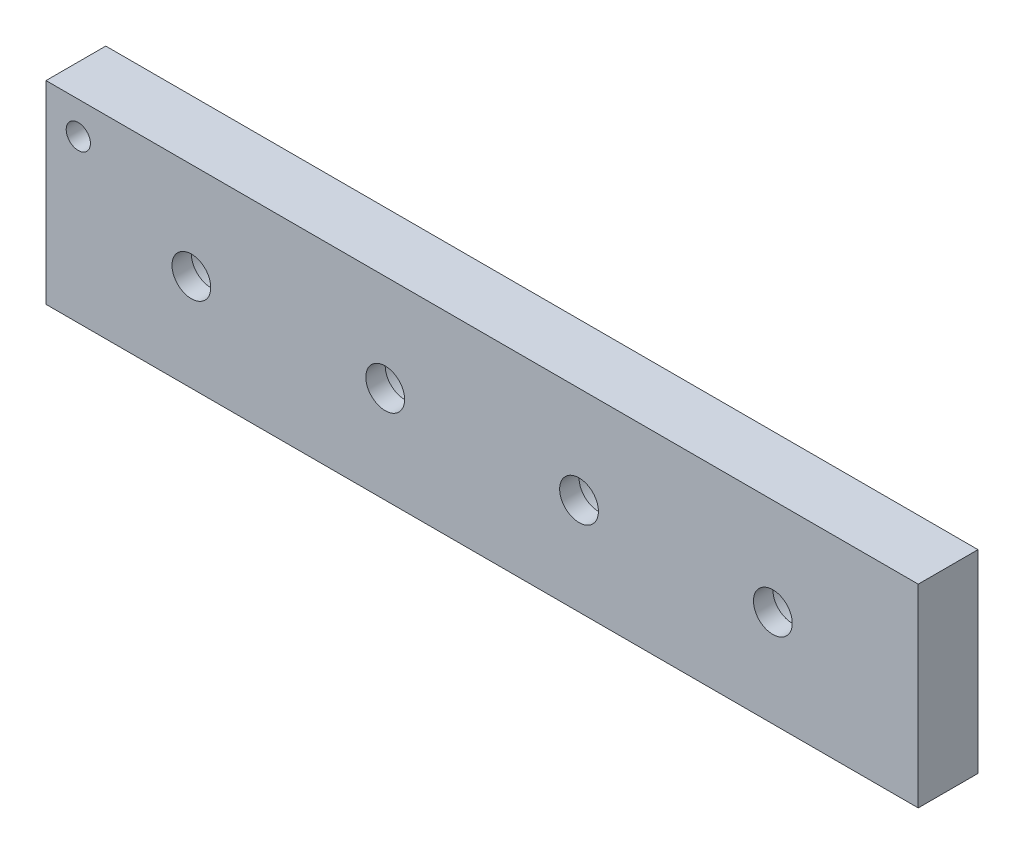
ISO-10303-21;
HEADER;
FILE_DESCRIPTION(('STEP AP214'),'2;1');
FILE_NAME('part.step','',(''),(''),'','','');
FILE_SCHEMA(('AUTOMOTIVE_DESIGN { 1 0 10303 214 1 1 1 1 }'));
ENDSEC;
DATA;
#1=APPLICATION_CONTEXT('core data for automotive mechanical design processes');
#2=APPLICATION_PROTOCOL_DEFINITION('international standard','automotive_design',2000,#1);
#3=PRODUCT_CONTEXT('',#1,'mechanical');
#4=PRODUCT('Part','Part','',(#3));
#5=PRODUCT_RELATED_PRODUCT_CATEGORY('part','',(#4));
#6=PRODUCT_DEFINITION_FORMATION('','',#4);
#7=PRODUCT_DEFINITION_CONTEXT('part definition',#1,'design');
#8=PRODUCT_DEFINITION('design','',#6,#7);
#9=PRODUCT_DEFINITION_SHAPE('','',#8);
#10=(LENGTH_UNIT() NAMED_UNIT(*) SI_UNIT(.MILLI.,.METRE.));
#11=(NAMED_UNIT(*) PLANE_ANGLE_UNIT() SI_UNIT($,.RADIAN.));
#12=(NAMED_UNIT(*) SI_UNIT($,.STERADIAN.) SOLID_ANGLE_UNIT());
#13=UNCERTAINTY_MEASURE_WITH_UNIT(LENGTH_MEASURE(1.E-05),#10,'distance_accuracy_value','');
#14=(GEOMETRIC_REPRESENTATION_CONTEXT(3) GLOBAL_UNCERTAINTY_ASSIGNED_CONTEXT((#13)) GLOBAL_UNIT_ASSIGNED_CONTEXT((#10,
#11,#12)) REPRESENTATION_CONTEXT('',''));
#15=CARTESIAN_POINT('',(0.,0.,0.));
#16=DIRECTION('',(0.,0.,1.));
#17=DIRECTION('',(1.,0.,0.));
#18=AXIS2_PLACEMENT_3D('',#15,#16,#17);
#19=CARTESIAN_POINT('',(-27.,-6.,3.7));
#20=DIRECTION('',(1.,0.,0.));
#21=DIRECTION('',(0.,0.,-1.));
#22=AXIS2_PLACEMENT_3D('',#19,#20,#21);
#23=PLANE('',#22);
#24=DIRECTION('',(0.,-1.,0.));
#25=VECTOR('',#24,1.);
#26=CARTESIAN_POINT('',(-27.,-6.,0.));
#27=LINE('',#26,#25);
#28=CARTESIAN_POINT('',(-27.,6.,0.));
#29=VERTEX_POINT('',#28);
#30=CARTESIAN_POINT('',(-27.,-6.,0.));
#31=VERTEX_POINT('',#30);
#32=EDGE_CURVE('E116',#29,#31,#27,.T.);
#33=ORIENTED_EDGE('',*,*,#32,.T.);
#34=DIRECTION('',(0.,0.,-1.));
#35=VECTOR('',#34,1.);
#36=CARTESIAN_POINT('',(-27.,-6.,3.7));
#37=LINE('',#36,#35);
#38=CARTESIAN_POINT('',(-27.,-6.,3.7));
#39=VERTEX_POINT('',#38);
#40=EDGE_CURVE('E11',#39,#31,#37,.T.);
#41=ORIENTED_EDGE('',*,*,#40,.F.);
#42=DIRECTION('',(0.,-1.,0.));
#43=VECTOR('',#42,1.);
#44=CARTESIAN_POINT('',(-27.,-6.,3.7));
#45=LINE('',#44,#43);
#46=CARTESIAN_POINT('',(-27.,6.,3.7));
#47=VERTEX_POINT('',#46);
#48=EDGE_CURVE('E97',#47,#39,#45,.T.);
#49=ORIENTED_EDGE('',*,*,#48,.F.);
#50=DIRECTION('',(0.,0.,-1.));
#51=VECTOR('',#50,1.);
#52=CARTESIAN_POINT('',(-27.,6.,3.7));
#53=LINE('',#52,#51);
#54=EDGE_CURVE('E115',#47,#29,#53,.T.);
#55=ORIENTED_EDGE('',*,*,#54,.T.);
#56=EDGE_LOOP('',(#33,#41,#49,#55));
#57=FACE_BOUND('',#56,.T.);
#58=ADVANCED_FACE('F44',(#57),#23,.F.);
#59=CARTESIAN_POINT('',(-27.,-6.,3.7));
#60=DIRECTION('',(0.,1.,0.));
#61=DIRECTION('',(0.,0.,1.));
#62=AXIS2_PLACEMENT_3D('',#59,#60,#61);
#63=PLANE('',#62);
#64=DIRECTION('',(1.,0.,0.));
#65=VECTOR('',#64,1.);
#66=CARTESIAN_POINT('',(-27.,-6.,0.));
#67=LINE('',#66,#65);
#68=CARTESIAN_POINT('',(27.,-6.,0.));
#69=VERTEX_POINT('',#68);
#70=EDGE_CURVE('E102',#31,#69,#67,.T.);
#71=ORIENTED_EDGE('',*,*,#70,.T.);
#72=DIRECTION('',(0.,0.,-1.));
#73=VECTOR('',#72,1.);
#74=CARTESIAN_POINT('',(27.,-6.,3.7));
#75=LINE('',#74,#73);
#76=CARTESIAN_POINT('',(27.,-6.,3.7));
#77=VERTEX_POINT('',#76);
#78=EDGE_CURVE('E54',#77,#69,#75,.T.);
#79=ORIENTED_EDGE('',*,*,#78,.F.);
#80=DIRECTION('',(1.,0.,0.));
#81=VECTOR('',#80,1.);
#82=CARTESIAN_POINT('',(-27.,-6.,3.7));
#83=LINE('',#82,#81);
#84=EDGE_CURVE('E94',#39,#77,#83,.T.);
#85=ORIENTED_EDGE('',*,*,#84,.F.);
#86=ORIENTED_EDGE('',*,*,#40,.T.);
#87=EDGE_LOOP('',(#71,#79,#85,#86));
#88=FACE_BOUND('',#87,.T.);
#89=ADVANCED_FACE('F103',(#88),#63,.F.);
#90=CARTESIAN_POINT('',(27.,-6.,3.7));
#91=DIRECTION('',(-1.,0.,0.));
#92=DIRECTION('',(0.,0.,1.));
#93=AXIS2_PLACEMENT_3D('',#90,#91,#92);
#94=PLANE('',#93);
#95=DIRECTION('',(0.,1.,0.));
#96=VECTOR('',#95,1.);
#97=CARTESIAN_POINT('',(27.,-6.,0.));
#98=LINE('',#97,#96);
#99=CARTESIAN_POINT('',(27.,6.,0.));
#100=VERTEX_POINT('',#99);
#101=EDGE_CURVE('E82',#69,#100,#98,.T.);
#102=ORIENTED_EDGE('',*,*,#101,.T.);
#103=DIRECTION('',(0.,0.,-1.));
#104=VECTOR('',#103,1.);
#105=CARTESIAN_POINT('',(27.,6.,3.7));
#106=LINE('',#105,#104);
#107=CARTESIAN_POINT('',(27.,6.,3.7));
#108=VERTEX_POINT('',#107);
#109=EDGE_CURVE('E106',#108,#100,#106,.T.);
#110=ORIENTED_EDGE('',*,*,#109,.F.);
#111=DIRECTION('',(0.,1.,0.));
#112=VECTOR('',#111,1.);
#113=CARTESIAN_POINT('',(27.,-6.,3.7));
#114=LINE('',#113,#112);
#115=EDGE_CURVE('E100',#77,#108,#114,.T.);
#116=ORIENTED_EDGE('',*,*,#115,.F.);
#117=ORIENTED_EDGE('',*,*,#78,.T.);
#118=EDGE_LOOP('',(#102,#110,#116,#117));
#119=FACE_BOUND('',#118,.T.);
#120=ADVANCED_FACE('F107',(#119),#94,.F.);
#121=CARTESIAN_POINT('',(-27.,6.,3.7));
#122=DIRECTION('',(0.,-1.,0.));
#123=DIRECTION('',(0.,0.,-1.));
#124=AXIS2_PLACEMENT_3D('',#121,#122,#123);
#125=PLANE('',#124);
#126=DIRECTION('',(-1.,0.,0.));
#127=VECTOR('',#126,1.);
#128=CARTESIAN_POINT('',(-27.,6.,0.));
#129=LINE('',#128,#127);
#130=EDGE_CURVE('E87',#100,#29,#129,.T.);
#131=ORIENTED_EDGE('',*,*,#130,.T.);
#132=ORIENTED_EDGE('',*,*,#54,.F.);
#133=DIRECTION('',(-1.,0.,0.));
#134=VECTOR('',#133,1.);
#135=CARTESIAN_POINT('',(-27.,6.,3.7));
#136=LINE('',#135,#134);
#137=EDGE_CURVE('E63',#108,#47,#136,.T.);
#138=ORIENTED_EDGE('',*,*,#137,.F.);
#139=ORIENTED_EDGE('',*,*,#109,.T.);
#140=EDGE_LOOP('',(#131,#132,#138,#139));
#141=FACE_BOUND('',#140,.T.);
#142=ADVANCED_FACE('F239',(#141),#125,.F.);
#143=CARTESIAN_POINT('',(0.,0.,3.7));
#144=DIRECTION('',(0.,0.,-1.));
#145=DIRECTION('',(-1.,0.,0.));
#146=AXIS2_PLACEMENT_3D('',#143,#144,#145);
#147=PLANE('',#146);
#148=CARTESIAN_POINT('',(-25.,4.,3.7));
#149=DIRECTION('',(0.,0.,1.));
#150=DIRECTION('',(1.,0.,0.));
#151=AXIS2_PLACEMENT_3D('',#148,#149,#150);
#152=CIRCLE('',#151,0.750000000000001);
#153=CARTESIAN_POINT('',(-25.75,4.,3.7));
#154=VERTEX_POINT('',#153);
#155=EDGE_CURVE('E199',#154,#154,#152,.T.);
#156=ORIENTED_EDGE('',*,*,#155,.F.);
#157=EDGE_LOOP('',(#156));
#158=FACE_BOUND('',#157,.T.);
#159=CARTESIAN_POINT('',(-18.,0.,3.7));
#160=DIRECTION('',(0.,0.,1.));
#161=DIRECTION('',(1.,0.,0.));
#162=AXIS2_PLACEMENT_3D('',#159,#160,#161);
#163=CIRCLE('',#162,1.2);
#164=CARTESIAN_POINT('',(-19.2,0.,3.7));
#165=VERTEX_POINT('',#164);
#166=EDGE_CURVE('E137',#165,#165,#163,.T.);
#167=ORIENTED_EDGE('',*,*,#166,.F.);
#168=EDGE_LOOP('',(#167));
#169=FACE_BOUND('',#168,.T.);
#170=CARTESIAN_POINT('',(-6.,0.,3.7));
#171=DIRECTION('',(0.,0.,1.));
#172=DIRECTION('',(1.,0.,0.));
#173=AXIS2_PLACEMENT_3D('',#170,#171,#172);
#174=CIRCLE('',#173,1.2);
#175=CARTESIAN_POINT('',(-7.2,0.,3.7));
#176=VERTEX_POINT('',#175);
#177=EDGE_CURVE('E194',#176,#176,#174,.T.);
#178=ORIENTED_EDGE('',*,*,#177,.F.);
#179=EDGE_LOOP('',(#178));
#180=FACE_BOUND('',#179,.T.);
#181=CARTESIAN_POINT('',(6.,0.,3.7));
#182=DIRECTION('',(0.,0.,1.));
#183=DIRECTION('',(1.,0.,0.));
#184=AXIS2_PLACEMENT_3D('',#181,#182,#183);
#185=CIRCLE('',#184,1.2);
#186=CARTESIAN_POINT('',(4.8,0.,3.7));
#187=VERTEX_POINT('',#186);
#188=EDGE_CURVE('E188',#187,#187,#185,.T.);
#189=ORIENTED_EDGE('',*,*,#188,.F.);
#190=EDGE_LOOP('',(#189));
#191=FACE_BOUND('',#190,.T.);
#192=CARTESIAN_POINT('',(18.,0.,3.7));
#193=DIRECTION('',(0.,0.,1.));
#194=DIRECTION('',(1.,0.,0.));
#195=AXIS2_PLACEMENT_3D('',#192,#193,#194);
#196=CIRCLE('',#195,1.2);
#197=CARTESIAN_POINT('',(16.8,0.,3.7));
#198=VERTEX_POINT('',#197);
#199=EDGE_CURVE('E183',#198,#198,#196,.T.);
#200=ORIENTED_EDGE('',*,*,#199,.F.);
#201=EDGE_LOOP('',(#200));
#202=FACE_BOUND('',#201,.T.);
#203=ORIENTED_EDGE('',*,*,#48,.T.);
#204=ORIENTED_EDGE('',*,*,#84,.T.);
#205=ORIENTED_EDGE('',*,*,#115,.T.);
#206=ORIENTED_EDGE('',*,*,#137,.T.);
#207=EDGE_LOOP('',(#203,#204,#205,#206));
#208=FACE_BOUND('',#207,.T.);
#209=ADVANCED_FACE('F92',(#158,#169,#180,#191,#202,#208),#147,.F.);
#210=CARTESIAN_POINT('',(0.,0.,0.));
#211=DIRECTION('',(0.,0.,-1.));
#212=DIRECTION('',(-1.,0.,0.));
#213=AXIS2_PLACEMENT_3D('',#210,#211,#212);
#214=PLANE('',#213);
#215=CARTESIAN_POINT('',(-25.,4.,0.));
#216=DIRECTION('',(0.,0.,-1.));
#217=DIRECTION('',(-1.,0.,0.));
#218=AXIS2_PLACEMENT_3D('',#215,#216,#217);
#219=CIRCLE('',#218,0.750000000000001);
#220=CARTESIAN_POINT('',(-25.75,4.,0.));
#221=VERTEX_POINT('',#220);
#222=EDGE_CURVE('E48',#221,#221,#219,.F.);
#223=ORIENTED_EDGE('',*,*,#222,.T.);
#224=EDGE_LOOP('',(#223));
#225=FACE_BOUND('',#224,.T.);
#226=CARTESIAN_POINT('',(-18.,0.,0.));
#227=DIRECTION('',(0.,0.,1.));
#228=DIRECTION('',(1.,0.,0.));
#229=AXIS2_PLACEMENT_3D('',#226,#227,#228);
#230=CIRCLE('',#229,2.325);
#231=CARTESIAN_POINT('',(-15.675,0.,0.));
#232=VERTEX_POINT('',#231);
#233=EDGE_CURVE('E163',#232,#232,#230,.T.);
#234=ORIENTED_EDGE('',*,*,#233,.T.);
#235=EDGE_LOOP('',(#234));
#236=FACE_BOUND('',#235,.T.);
#237=CARTESIAN_POINT('',(-6.,0.,0.));
#238=DIRECTION('',(0.,0.,1.));
#239=DIRECTION('',(1.,0.,0.));
#240=AXIS2_PLACEMENT_3D('',#237,#238,#239);
#241=CIRCLE('',#240,2.375);
#242=CARTESIAN_POINT('',(-3.625,0.,0.));
#243=VERTEX_POINT('',#242);
#244=EDGE_CURVE('E169',#243,#243,#241,.T.);
#245=ORIENTED_EDGE('',*,*,#244,.T.);
#246=EDGE_LOOP('',(#245));
#247=FACE_BOUND('',#246,.T.);
#248=CARTESIAN_POINT('',(6.,0.,0.));
#249=DIRECTION('',(0.,0.,1.));
#250=DIRECTION('',(1.,0.,0.));
#251=AXIS2_PLACEMENT_3D('',#248,#249,#250);
#252=CIRCLE('',#251,2.425);
#253=CARTESIAN_POINT('',(8.425,0.,0.));
#254=VERTEX_POINT('',#253);
#255=EDGE_CURVE('E177',#254,#254,#252,.T.);
#256=ORIENTED_EDGE('',*,*,#255,.T.);
#257=EDGE_LOOP('',(#256));
#258=FACE_BOUND('',#257,.T.);
#259=CARTESIAN_POINT('',(18.,0.,0.));
#260=DIRECTION('',(0.,0.,1.));
#261=DIRECTION('',(1.,0.,0.));
#262=AXIS2_PLACEMENT_3D('',#259,#260,#261);
#263=CIRCLE('',#262,2.475);
#264=CARTESIAN_POINT('',(20.475,0.,0.));
#265=VERTEX_POINT('',#264);
#266=EDGE_CURVE('E151',#265,#265,#263,.T.);
#267=ORIENTED_EDGE('',*,*,#266,.T.);
#268=EDGE_LOOP('',(#267));
#269=FACE_BOUND('',#268,.T.);
#270=ORIENTED_EDGE('',*,*,#32,.F.);
#271=ORIENTED_EDGE('',*,*,#130,.F.);
#272=ORIENTED_EDGE('',*,*,#101,.F.);
#273=ORIENTED_EDGE('',*,*,#70,.F.);
#274=EDGE_LOOP('',(#270,#271,#272,#273));
#275=FACE_BOUND('',#274,.T.);
#276=ADVANCED_FACE('F207',(#225,#236,#247,#258,#269,#275),#214,.T.);
#277=CARTESIAN_POINT('',(18.,0.,2.5));
#278=DIRECTION('',(0.,0.,-1.));
#279=DIRECTION('',(-1.,0.,0.));
#280=AXIS2_PLACEMENT_3D('',#277,#278,#279);
#281=CYLINDRICAL_SURFACE('',#280,2.475);
#282=CARTESIAN_POINT('',(18.,0.,2.5));
#283=DIRECTION('',(0.,0.,1.));
#284=DIRECTION('',(1.,0.,0.));
#285=AXIS2_PLACEMENT_3D('',#282,#283,#284);
#286=CIRCLE('',#285,2.475);
#287=CARTESIAN_POINT('',(20.475,0.,2.5));
#288=VERTEX_POINT('',#287);
#289=EDGE_CURVE('E148',#288,#288,#286,.T.);
#290=ORIENTED_EDGE('',*,*,#289,.T.);
#291=EDGE_LOOP('',(#290));
#292=FACE_BOUND('',#291,.T.);
#293=ORIENTED_EDGE('',*,*,#266,.F.);
#294=EDGE_LOOP('',(#293));
#295=FACE_BOUND('',#294,.T.);
#296=ADVANCED_FACE('F232',(#292,#295),#281,.F.);
#297=CARTESIAN_POINT('',(18.,0.,2.5));
#298=DIRECTION('',(0.,0.,1.));
#299=DIRECTION('',(1.,0.,0.));
#300=AXIS2_PLACEMENT_3D('',#297,#298,#299);
#301=PLANE('',#300);
#302=CARTESIAN_POINT('',(18.,0.,2.5));
#303=DIRECTION('',(0.,0.,1.));
#304=DIRECTION('',(1.,0.,0.));
#305=AXIS2_PLACEMENT_3D('',#302,#303,#304);
#306=CIRCLE('',#305,1.2);
#307=CARTESIAN_POINT('',(16.8,0.,2.5));
#308=VERTEX_POINT('',#307);
#309=EDGE_CURVE('E141',#308,#308,#306,.F.);
#310=ORIENTED_EDGE('',*,*,#309,.F.);
#311=EDGE_LOOP('',(#310));
#312=FACE_BOUND('',#311,.T.);
#313=ORIENTED_EDGE('',*,*,#289,.F.);
#314=EDGE_LOOP('',(#313));
#315=FACE_BOUND('',#314,.T.);
#316=ADVANCED_FACE('F240',(#312,#315),#301,.F.);
#317=CARTESIAN_POINT('',(6.,0.,2.5));
#318=DIRECTION('',(0.,0.,-1.));
#319=DIRECTION('',(-1.,0.,0.));
#320=AXIS2_PLACEMENT_3D('',#317,#318,#319);
#321=CYLINDRICAL_SURFACE('',#320,2.425);
#322=CARTESIAN_POINT('',(6.,0.,2.5));
#323=DIRECTION('',(0.,0.,1.));
#324=DIRECTION('',(1.,0.,0.));
#325=AXIS2_PLACEMENT_3D('',#322,#323,#324);
#326=CIRCLE('',#325,2.425);
#327=CARTESIAN_POINT('',(8.425,0.,2.5));
#328=VERTEX_POINT('',#327);
#329=EDGE_CURVE('E160',#328,#328,#326,.T.);
#330=ORIENTED_EDGE('',*,*,#329,.T.);
#331=EDGE_LOOP('',(#330));
#332=FACE_BOUND('',#331,.T.);
#333=ORIENTED_EDGE('',*,*,#255,.F.);
#334=EDGE_LOOP('',(#333));
#335=FACE_BOUND('',#334,.T.);
#336=ADVANCED_FACE('F270',(#332,#335),#321,.F.);
#337=CARTESIAN_POINT('',(6.,0.,2.5));
#338=DIRECTION('',(0.,0.,1.));
#339=DIRECTION('',(1.,0.,0.));
#340=AXIS2_PLACEMENT_3D('',#337,#338,#339);
#341=PLANE('',#340);
#342=CARTESIAN_POINT('',(6.,0.,2.5));
#343=DIRECTION('',(0.,0.,1.));
#344=DIRECTION('',(1.,0.,0.));
#345=AXIS2_PLACEMENT_3D('',#342,#343,#344);
#346=CIRCLE('',#345,1.2);
#347=CARTESIAN_POINT('',(4.8,0.,2.5));
#348=VERTEX_POINT('',#347);
#349=EDGE_CURVE('E138',#348,#348,#346,.F.);
#350=ORIENTED_EDGE('',*,*,#349,.F.);
#351=EDGE_LOOP('',(#350));
#352=FACE_BOUND('',#351,.T.);
#353=ORIENTED_EDGE('',*,*,#329,.F.);
#354=EDGE_LOOP('',(#353));
#355=FACE_BOUND('',#354,.T.);
#356=ADVANCED_FACE('F271',(#352,#355),#341,.F.);
#357=CARTESIAN_POINT('',(-6.,0.,2.5));
#358=DIRECTION('',(0.,0.,-1.));
#359=DIRECTION('',(-1.,0.,0.));
#360=AXIS2_PLACEMENT_3D('',#357,#358,#359);
#361=CYLINDRICAL_SURFACE('',#360,2.375);
#362=CARTESIAN_POINT('',(-6.,0.,2.5));
#363=DIRECTION('',(0.,0.,1.));
#364=DIRECTION('',(1.,0.,0.));
#365=AXIS2_PLACEMENT_3D('',#362,#363,#364);
#366=CIRCLE('',#365,2.375);
#367=CARTESIAN_POINT('',(-3.625,0.,2.5));
#368=VERTEX_POINT('',#367);
#369=EDGE_CURVE('E172',#368,#368,#366,.T.);
#370=ORIENTED_EDGE('',*,*,#369,.T.);
#371=EDGE_LOOP('',(#370));
#372=FACE_BOUND('',#371,.T.);
#373=ORIENTED_EDGE('',*,*,#244,.F.);
#374=EDGE_LOOP('',(#373));
#375=FACE_BOUND('',#374,.T.);
#376=ADVANCED_FACE('F280',(#372,#375),#361,.F.);
#377=CARTESIAN_POINT('',(-6.,0.,2.5));
#378=DIRECTION('',(0.,0.,1.));
#379=DIRECTION('',(1.,0.,0.));
#380=AXIS2_PLACEMENT_3D('',#377,#378,#379);
#381=PLANE('',#380);
#382=CARTESIAN_POINT('',(-6.,0.,2.5));
#383=DIRECTION('',(0.,0.,1.));
#384=DIRECTION('',(1.,0.,0.));
#385=AXIS2_PLACEMENT_3D('',#382,#383,#384);
#386=CIRCLE('',#385,1.2);
#387=CARTESIAN_POINT('',(-7.2,0.,2.5));
#388=VERTEX_POINT('',#387);
#389=EDGE_CURVE('E135',#388,#388,#386,.F.);
#390=ORIENTED_EDGE('',*,*,#389,.F.);
#391=EDGE_LOOP('',(#390));
#392=FACE_BOUND('',#391,.T.);
#393=ORIENTED_EDGE('',*,*,#369,.F.);
#394=EDGE_LOOP('',(#393));
#395=FACE_BOUND('',#394,.T.);
#396=ADVANCED_FACE('F281',(#392,#395),#381,.F.);
#397=CARTESIAN_POINT('',(-18.,0.,2.5));
#398=DIRECTION('',(0.,0.,-1.));
#399=DIRECTION('',(-1.,0.,0.));
#400=AXIS2_PLACEMENT_3D('',#397,#398,#399);
#401=CYLINDRICAL_SURFACE('',#400,2.325);
#402=CARTESIAN_POINT('',(-18.,0.,2.5));
#403=DIRECTION('',(0.,0.,1.));
#404=DIRECTION('',(1.,0.,0.));
#405=AXIS2_PLACEMENT_3D('',#402,#403,#404);
#406=CIRCLE('',#405,2.325);
#407=CARTESIAN_POINT('',(-15.675,0.,2.5));
#408=VERTEX_POINT('',#407);
#409=EDGE_CURVE('E120',#408,#408,#406,.T.);
#410=ORIENTED_EDGE('',*,*,#409,.T.);
#411=EDGE_LOOP('',(#410));
#412=FACE_BOUND('',#411,.T.);
#413=ORIENTED_EDGE('',*,*,#233,.F.);
#414=EDGE_LOOP('',(#413));
#415=FACE_BOUND('',#414,.T.);
#416=ADVANCED_FACE('F289',(#412,#415),#401,.F.);
#417=CARTESIAN_POINT('',(-18.,0.,2.5));
#418=DIRECTION('',(0.,0.,1.));
#419=DIRECTION('',(1.,0.,0.));
#420=AXIS2_PLACEMENT_3D('',#417,#418,#419);
#421=PLANE('',#420);
#422=CARTESIAN_POINT('',(-18.,0.,2.5));
#423=DIRECTION('',(0.,0.,1.));
#424=DIRECTION('',(1.,0.,0.));
#425=AXIS2_PLACEMENT_3D('',#422,#423,#424);
#426=CIRCLE('',#425,1.2);
#427=CARTESIAN_POINT('',(-19.2,0.,2.5));
#428=VERTEX_POINT('',#427);
#429=EDGE_CURVE('E131',#428,#428,#426,.F.);
#430=ORIENTED_EDGE('',*,*,#429,.F.);
#431=EDGE_LOOP('',(#430));
#432=FACE_BOUND('',#431,.T.);
#433=ORIENTED_EDGE('',*,*,#409,.F.);
#434=EDGE_LOOP('',(#433));
#435=FACE_BOUND('',#434,.T.);
#436=ADVANCED_FACE('F295',(#432,#435),#421,.F.);
#437=CARTESIAN_POINT('',(-18.,0.,3.7));
#438=DIRECTION('',(0.,0.,-1.));
#439=DIRECTION('',(-1.,0.,0.));
#440=AXIS2_PLACEMENT_3D('',#437,#438,#439);
#441=CYLINDRICAL_SURFACE('',#440,1.2);
#442=CARTESIAN_POINT('',(-19.2,0.,3.7));
#443=CARTESIAN_POINT('',(-19.2,0.,3.6875));
#444=CARTESIAN_POINT('',(-19.2,0.,3.675));
#445=CARTESIAN_POINT('',(-19.2,0.,3.65));
#446=CARTESIAN_POINT('',(-19.2,0.,3.6375));
#447=CARTESIAN_POINT('',(-19.2,0.,3.6125));
#448=CARTESIAN_POINT('',(-19.2,0.,3.6));
#449=CARTESIAN_POINT('',(-19.2,0.,3.575));
#450=CARTESIAN_POINT('',(-19.2,0.,3.5625));
#451=CARTESIAN_POINT('',(-19.2,0.,3.5375));
#452=CARTESIAN_POINT('',(-19.2,0.,3.525));
#453=CARTESIAN_POINT('',(-19.2,0.,3.5));
#454=CARTESIAN_POINT('',(-19.2,0.,3.4875));
#455=CARTESIAN_POINT('',(-19.2,0.,3.4625));
#456=CARTESIAN_POINT('',(-19.2,0.,3.45));
#457=CARTESIAN_POINT('',(-19.2,0.,3.425));
#458=CARTESIAN_POINT('',(-19.2,0.,3.4125));
#459=CARTESIAN_POINT('',(-19.2,0.,3.3875));
#460=CARTESIAN_POINT('',(-19.2,0.,3.375));
#461=CARTESIAN_POINT('',(-19.2,0.,3.35));
#462=CARTESIAN_POINT('',(-19.2,0.,3.3375));
#463=CARTESIAN_POINT('',(-19.2,0.,3.3125));
#464=CARTESIAN_POINT('',(-19.2,0.,3.3));
#465=CARTESIAN_POINT('',(-19.2,0.,3.275));
#466=CARTESIAN_POINT('',(-19.2,0.,3.2625));
#467=CARTESIAN_POINT('',(-19.2,0.,3.2375));
#468=CARTESIAN_POINT('',(-19.2,0.,3.225));
#469=CARTESIAN_POINT('',(-19.2,0.,3.2));
#470=CARTESIAN_POINT('',(-19.2,0.,3.1875));
#471=CARTESIAN_POINT('',(-19.2,0.,3.1625));
#472=CARTESIAN_POINT('',(-19.2,0.,3.15));
#473=CARTESIAN_POINT('',(-19.2,0.,3.125));
#474=CARTESIAN_POINT('',(-19.2,0.,3.1125));
#475=CARTESIAN_POINT('',(-19.2,0.,3.0875));
#476=CARTESIAN_POINT('',(-19.2,0.,3.075));
#477=CARTESIAN_POINT('',(-19.2,0.,3.05));
#478=CARTESIAN_POINT('',(-19.2,0.,3.0375));
#479=CARTESIAN_POINT('',(-19.2,0.,3.0125));
#480=CARTESIAN_POINT('',(-19.2,0.,3.));
#481=CARTESIAN_POINT('',(-19.2,0.,2.975));
#482=CARTESIAN_POINT('',(-19.2,0.,2.9625));
#483=CARTESIAN_POINT('',(-19.2,0.,2.9375));
#484=CARTESIAN_POINT('',(-19.2,0.,2.925));
#485=CARTESIAN_POINT('',(-19.2,0.,2.9));
#486=CARTESIAN_POINT('',(-19.2,0.,2.8875));
#487=CARTESIAN_POINT('',(-19.2,0.,2.8625));
#488=CARTESIAN_POINT('',(-19.2,0.,2.85));
#489=CARTESIAN_POINT('',(-19.2,0.,2.825));
#490=CARTESIAN_POINT('',(-19.2,0.,2.8125));
#491=CARTESIAN_POINT('',(-19.2,0.,2.7875));
#492=CARTESIAN_POINT('',(-19.2,0.,2.775));
#493=CARTESIAN_POINT('',(-19.2,0.,2.75));
#494=CARTESIAN_POINT('',(-19.2,0.,2.7375));
#495=CARTESIAN_POINT('',(-19.2,0.,2.7125));
#496=CARTESIAN_POINT('',(-19.2,0.,2.7));
#497=CARTESIAN_POINT('',(-19.2,0.,2.675));
#498=CARTESIAN_POINT('',(-19.2,0.,2.6625));
#499=CARTESIAN_POINT('',(-19.2,0.,2.6375));
#500=CARTESIAN_POINT('',(-19.2,0.,2.625));
#501=CARTESIAN_POINT('',(-19.2,0.,2.6));
#502=CARTESIAN_POINT('',(-19.2,0.,2.5875));
#503=CARTESIAN_POINT('',(-19.2,0.,2.5625));
#504=CARTESIAN_POINT('',(-19.2,0.,2.55));
#505=CARTESIAN_POINT('',(-19.2,0.,2.525));
#506=CARTESIAN_POINT('',(-19.2,0.,2.5125));
#507=CARTESIAN_POINT('',(-19.2,0.,2.5));
#508=B_SPLINE_CURVE_WITH_KNOTS('',3,(#442,#443,#444,#445,#446,#447,#448,#449,#450,#451,#452,
#453,#454,#455,#456,#457,#458,#459,#460,#461,#462,#463,#464,#465,#466,#467,#468,#469,#470,#471,
#472,#473,#474,#475,#476,#477,#478,#479,#480,#481,#482,#483,#484,#485,#486,#487,#488,#489,#490,
#491,#492,#493,#494,#495,#496,#497,#498,#499,#500,#501,#502,#503,#504,#505,#506,#507),
.UNSPECIFIED.,.F.,.F.,(4,2,2,2,2,2,2,2,2,2,2,2,2,2,2,2,2,2,2,2,2,2,2,2,2,2,2,2,2,2,2,2,4),(0.,
0.0375000000000002,0.0750000000000004,0.1125,0.15,0.187500000000001,0.225,0.262500000000001,
0.300000000000001,0.337500000000001,0.375000000000001,0.412500000000001,0.450000000000001,
0.487500000000001,0.525000000000001,0.562500000000001,0.600000000000001,0.637500000000001,
0.675000000000001,0.712500000000001,0.750000000000002,0.787500000000001,0.825000000000002,
0.862500000000002,0.900000000000001,0.937500000000002,0.975000000000002,1.0125,1.05,1.0875,
1.125,1.1625,1.2),.UNSPECIFIED.);
#509=EDGE_CURVE('BSEAM321',#165,#428,#508,.T.);
#510=ORIENTED_EDGE('',*,*,#166,.T.);
#511=ORIENTED_EDGE('',*,*,#429,.T.);
#512=ORIENTED_EDGE('',*,*,#509,.T.);
#513=ORIENTED_EDGE('',*,*,#509,.F.);
#514=EDGE_LOOP('',(#510,#512,#511,#513));
#515=FACE_BOUND('',#514,.T.);
#516=ADVANCED_FACE('F321',(#515),#441,.F.);
#517=CARTESIAN_POINT('',(-6.,0.,3.7));
#518=DIRECTION('',(0.,0.,-1.));
#519=DIRECTION('',(-1.,0.,0.));
#520=AXIS2_PLACEMENT_3D('',#517,#518,#519);
#521=CYLINDRICAL_SURFACE('',#520,1.2);
#522=CARTESIAN_POINT('',(-7.2,0.,3.7));
#523=CARTESIAN_POINT('',(-7.2,0.,3.6875));
#524=CARTESIAN_POINT('',(-7.2,0.,3.675));
#525=CARTESIAN_POINT('',(-7.2,0.,3.65));
#526=CARTESIAN_POINT('',(-7.2,0.,3.6375));
#527=CARTESIAN_POINT('',(-7.2,0.,3.6125));
#528=CARTESIAN_POINT('',(-7.2,0.,3.6));
#529=CARTESIAN_POINT('',(-7.2,0.,3.575));
#530=CARTESIAN_POINT('',(-7.2,0.,3.5625));
#531=CARTESIAN_POINT('',(-7.2,0.,3.5375));
#532=CARTESIAN_POINT('',(-7.2,0.,3.525));
#533=CARTESIAN_POINT('',(-7.2,0.,3.5));
#534=CARTESIAN_POINT('',(-7.2,0.,3.4875));
#535=CARTESIAN_POINT('',(-7.2,0.,3.4625));
#536=CARTESIAN_POINT('',(-7.2,0.,3.45));
#537=CARTESIAN_POINT('',(-7.2,0.,3.425));
#538=CARTESIAN_POINT('',(-7.2,0.,3.4125));
#539=CARTESIAN_POINT('',(-7.2,0.,3.3875));
#540=CARTESIAN_POINT('',(-7.2,0.,3.375));
#541=CARTESIAN_POINT('',(-7.2,0.,3.35));
#542=CARTESIAN_POINT('',(-7.2,0.,3.3375));
#543=CARTESIAN_POINT('',(-7.2,0.,3.3125));
#544=CARTESIAN_POINT('',(-7.2,0.,3.3));
#545=CARTESIAN_POINT('',(-7.2,0.,3.275));
#546=CARTESIAN_POINT('',(-7.2,0.,3.2625));
#547=CARTESIAN_POINT('',(-7.2,0.,3.2375));
#548=CARTESIAN_POINT('',(-7.2,0.,3.225));
#549=CARTESIAN_POINT('',(-7.2,0.,3.2));
#550=CARTESIAN_POINT('',(-7.2,0.,3.1875));
#551=CARTESIAN_POINT('',(-7.2,0.,3.1625));
#552=CARTESIAN_POINT('',(-7.2,0.,3.15));
#553=CARTESIAN_POINT('',(-7.2,0.,3.125));
#554=CARTESIAN_POINT('',(-7.2,0.,3.1125));
#555=CARTESIAN_POINT('',(-7.2,0.,3.0875));
#556=CARTESIAN_POINT('',(-7.2,0.,3.075));
#557=CARTESIAN_POINT('',(-7.2,0.,3.05));
#558=CARTESIAN_POINT('',(-7.2,0.,3.0375));
#559=CARTESIAN_POINT('',(-7.2,0.,3.0125));
#560=CARTESIAN_POINT('',(-7.2,0.,3.));
#561=CARTESIAN_POINT('',(-7.2,0.,2.975));
#562=CARTESIAN_POINT('',(-7.2,0.,2.9625));
#563=CARTESIAN_POINT('',(-7.2,0.,2.9375));
#564=CARTESIAN_POINT('',(-7.2,0.,2.925));
#565=CARTESIAN_POINT('',(-7.2,0.,2.9));
#566=CARTESIAN_POINT('',(-7.2,0.,2.8875));
#567=CARTESIAN_POINT('',(-7.2,0.,2.8625));
#568=CARTESIAN_POINT('',(-7.2,0.,2.85));
#569=CARTESIAN_POINT('',(-7.2,0.,2.825));
#570=CARTESIAN_POINT('',(-7.2,0.,2.8125));
#571=CARTESIAN_POINT('',(-7.2,0.,2.7875));
#572=CARTESIAN_POINT('',(-7.2,0.,2.775));
#573=CARTESIAN_POINT('',(-7.2,0.,2.75));
#574=CARTESIAN_POINT('',(-7.2,0.,2.7375));
#575=CARTESIAN_POINT('',(-7.2,0.,2.7125));
#576=CARTESIAN_POINT('',(-7.2,0.,2.7));
#577=CARTESIAN_POINT('',(-7.2,0.,2.675));
#578=CARTESIAN_POINT('',(-7.2,0.,2.6625));
#579=CARTESIAN_POINT('',(-7.2,0.,2.6375));
#580=CARTESIAN_POINT('',(-7.2,0.,2.625));
#581=CARTESIAN_POINT('',(-7.2,0.,2.6));
#582=CARTESIAN_POINT('',(-7.2,0.,2.5875));
#583=CARTESIAN_POINT('',(-7.2,0.,2.5625));
#584=CARTESIAN_POINT('',(-7.2,0.,2.55));
#585=CARTESIAN_POINT('',(-7.2,0.,2.525));
#586=CARTESIAN_POINT('',(-7.2,0.,2.5125));
#587=CARTESIAN_POINT('',(-7.2,0.,2.5));
#588=B_SPLINE_CURVE_WITH_KNOTS('',3,(#522,#523,#524,#525,#526,#527,#528,#529,#530,#531,#532,
#533,#534,#535,#536,#537,#538,#539,#540,#541,#542,#543,#544,#545,#546,#547,#548,#549,#550,#551,
#552,#553,#554,#555,#556,#557,#558,#559,#560,#561,#562,#563,#564,#565,#566,#567,#568,#569,#570,
#571,#572,#573,#574,#575,#576,#577,#578,#579,#580,#581,#582,#583,#584,#585,#586,#587),
.UNSPECIFIED.,.F.,.F.,(4,2,2,2,2,2,2,2,2,2,2,2,2,2,2,2,2,2,2,2,2,2,2,2,2,2,2,2,2,2,2,2,4),(0.,
0.0375000000000002,0.0750000000000004,0.1125,0.15,0.187500000000001,0.225,0.262500000000001,
0.300000000000001,0.337500000000001,0.375000000000001,0.412500000000001,0.450000000000001,
0.487500000000001,0.525000000000001,0.562500000000001,0.600000000000001,0.637500000000001,
0.675000000000001,0.712500000000001,0.750000000000002,0.787500000000001,0.825000000000002,
0.862500000000002,0.900000000000001,0.937500000000002,0.975000000000002,1.0125,1.05,1.0875,
1.125,1.1625,1.2),.UNSPECIFIED.);
#589=EDGE_CURVE('BSEAM329',#176,#388,#588,.T.);
#590=ORIENTED_EDGE('',*,*,#177,.T.);
#591=ORIENTED_EDGE('',*,*,#389,.T.);
#592=ORIENTED_EDGE('',*,*,#589,.T.);
#593=ORIENTED_EDGE('',*,*,#589,.F.);
#594=EDGE_LOOP('',(#590,#592,#591,#593));
#595=FACE_BOUND('',#594,.T.);
#596=ADVANCED_FACE('F329',(#595),#521,.F.);
#597=CARTESIAN_POINT('',(6.,0.,3.7));
#598=DIRECTION('',(0.,0.,-1.));
#599=DIRECTION('',(-1.,0.,0.));
#600=AXIS2_PLACEMENT_3D('',#597,#598,#599);
#601=CYLINDRICAL_SURFACE('',#600,1.2);
#602=CARTESIAN_POINT('',(4.8,0.,3.7));
#603=CARTESIAN_POINT('',(4.8,0.,3.6875));
#604=CARTESIAN_POINT('',(4.8,0.,3.675));
#605=CARTESIAN_POINT('',(4.8,0.,3.65));
#606=CARTESIAN_POINT('',(4.8,0.,3.6375));
#607=CARTESIAN_POINT('',(4.8,0.,3.6125));
#608=CARTESIAN_POINT('',(4.8,0.,3.6));
#609=CARTESIAN_POINT('',(4.8,0.,3.575));
#610=CARTESIAN_POINT('',(4.8,0.,3.5625));
#611=CARTESIAN_POINT('',(4.8,0.,3.5375));
#612=CARTESIAN_POINT('',(4.8,0.,3.525));
#613=CARTESIAN_POINT('',(4.8,0.,3.5));
#614=CARTESIAN_POINT('',(4.8,0.,3.4875));
#615=CARTESIAN_POINT('',(4.8,0.,3.4625));
#616=CARTESIAN_POINT('',(4.8,0.,3.45));
#617=CARTESIAN_POINT('',(4.8,0.,3.425));
#618=CARTESIAN_POINT('',(4.8,0.,3.4125));
#619=CARTESIAN_POINT('',(4.8,0.,3.3875));
#620=CARTESIAN_POINT('',(4.8,0.,3.375));
#621=CARTESIAN_POINT('',(4.8,0.,3.35));
#622=CARTESIAN_POINT('',(4.8,0.,3.3375));
#623=CARTESIAN_POINT('',(4.8,0.,3.3125));
#624=CARTESIAN_POINT('',(4.8,0.,3.3));
#625=CARTESIAN_POINT('',(4.8,0.,3.275));
#626=CARTESIAN_POINT('',(4.8,0.,3.2625));
#627=CARTESIAN_POINT('',(4.8,0.,3.2375));
#628=CARTESIAN_POINT('',(4.8,0.,3.225));
#629=CARTESIAN_POINT('',(4.8,0.,3.2));
#630=CARTESIAN_POINT('',(4.8,0.,3.1875));
#631=CARTESIAN_POINT('',(4.8,0.,3.1625));
#632=CARTESIAN_POINT('',(4.8,0.,3.15));
#633=CARTESIAN_POINT('',(4.8,0.,3.125));
#634=CARTESIAN_POINT('',(4.8,0.,3.1125));
#635=CARTESIAN_POINT('',(4.8,0.,3.0875));
#636=CARTESIAN_POINT('',(4.8,0.,3.075));
#637=CARTESIAN_POINT('',(4.8,0.,3.05));
#638=CARTESIAN_POINT('',(4.8,0.,3.0375));
#639=CARTESIAN_POINT('',(4.8,0.,3.0125));
#640=CARTESIAN_POINT('',(4.8,0.,3.));
#641=CARTESIAN_POINT('',(4.8,0.,2.975));
#642=CARTESIAN_POINT('',(4.8,0.,2.9625));
#643=CARTESIAN_POINT('',(4.8,0.,2.9375));
#644=CARTESIAN_POINT('',(4.8,0.,2.925));
#645=CARTESIAN_POINT('',(4.8,0.,2.9));
#646=CARTESIAN_POINT('',(4.8,0.,2.8875));
#647=CARTESIAN_POINT('',(4.8,0.,2.8625));
#648=CARTESIAN_POINT('',(4.8,0.,2.85));
#649=CARTESIAN_POINT('',(4.8,0.,2.825));
#650=CARTESIAN_POINT('',(4.8,0.,2.8125));
#651=CARTESIAN_POINT('',(4.8,0.,2.7875));
#652=CARTESIAN_POINT('',(4.8,0.,2.775));
#653=CARTESIAN_POINT('',(4.8,0.,2.75));
#654=CARTESIAN_POINT('',(4.8,0.,2.7375));
#655=CARTESIAN_POINT('',(4.8,0.,2.7125));
#656=CARTESIAN_POINT('',(4.8,0.,2.7));
#657=CARTESIAN_POINT('',(4.8,0.,2.675));
#658=CARTESIAN_POINT('',(4.8,0.,2.6625));
#659=CARTESIAN_POINT('',(4.8,0.,2.6375));
#660=CARTESIAN_POINT('',(4.8,0.,2.625));
#661=CARTESIAN_POINT('',(4.8,0.,2.6));
#662=CARTESIAN_POINT('',(4.8,0.,2.5875));
#663=CARTESIAN_POINT('',(4.8,0.,2.5625));
#664=CARTESIAN_POINT('',(4.8,0.,2.55));
#665=CARTESIAN_POINT('',(4.8,0.,2.525));
#666=CARTESIAN_POINT('',(4.8,0.,2.5125));
#667=CARTESIAN_POINT('',(4.8,0.,2.5));
#668=B_SPLINE_CURVE_WITH_KNOTS('',3,(#602,#603,#604,#605,#606,#607,#608,#609,#610,#611,#612,
#613,#614,#615,#616,#617,#618,#619,#620,#621,#622,#623,#624,#625,#626,#627,#628,#629,#630,#631,
#632,#633,#634,#635,#636,#637,#638,#639,#640,#641,#642,#643,#644,#645,#646,#647,#648,#649,#650,
#651,#652,#653,#654,#655,#656,#657,#658,#659,#660,#661,#662,#663,#664,#665,#666,#667),
.UNSPECIFIED.,.F.,.F.,(4,2,2,2,2,2,2,2,2,2,2,2,2,2,2,2,2,2,2,2,2,2,2,2,2,2,2,2,2,2,2,2,4),(0.,
0.0375000000000002,0.0750000000000004,0.1125,0.15,0.187500000000001,0.225,0.262500000000001,
0.300000000000001,0.337500000000001,0.375000000000001,0.412500000000001,0.450000000000001,
0.487500000000001,0.525000000000001,0.562500000000001,0.600000000000001,0.637500000000001,
0.675000000000001,0.712500000000001,0.750000000000002,0.787500000000001,0.825000000000002,
0.862500000000002,0.900000000000001,0.937500000000002,0.975000000000002,1.0125,1.05,1.0875,
1.125,1.1625,1.2),.UNSPECIFIED.);
#669=EDGE_CURVE('BSEAM219',#187,#348,#668,.T.);
#670=ORIENTED_EDGE('',*,*,#188,.T.);
#671=ORIENTED_EDGE('',*,*,#349,.T.);
#672=ORIENTED_EDGE('',*,*,#669,.T.);
#673=ORIENTED_EDGE('',*,*,#669,.F.);
#674=EDGE_LOOP('',(#670,#672,#671,#673));
#675=FACE_BOUND('',#674,.T.);
#676=ADVANCED_FACE('F219',(#675),#601,.F.);
#677=CARTESIAN_POINT('',(18.,0.,3.7));
#678=DIRECTION('',(0.,0.,-1.));
#679=DIRECTION('',(-1.,0.,0.));
#680=AXIS2_PLACEMENT_3D('',#677,#678,#679);
#681=CYLINDRICAL_SURFACE('',#680,1.2);
#682=CARTESIAN_POINT('',(16.8,0.,3.7));
#683=CARTESIAN_POINT('',(16.8,0.,3.6875));
#684=CARTESIAN_POINT('',(16.8,0.,3.675));
#685=CARTESIAN_POINT('',(16.8,0.,3.65));
#686=CARTESIAN_POINT('',(16.8,0.,3.6375));
#687=CARTESIAN_POINT('',(16.8,0.,3.6125));
#688=CARTESIAN_POINT('',(16.8,0.,3.6));
#689=CARTESIAN_POINT('',(16.8,0.,3.575));
#690=CARTESIAN_POINT('',(16.8,0.,3.5625));
#691=CARTESIAN_POINT('',(16.8,0.,3.5375));
#692=CARTESIAN_POINT('',(16.8,0.,3.525));
#693=CARTESIAN_POINT('',(16.8,0.,3.5));
#694=CARTESIAN_POINT('',(16.8,0.,3.4875));
#695=CARTESIAN_POINT('',(16.8,0.,3.4625));
#696=CARTESIAN_POINT('',(16.8,0.,3.45));
#697=CARTESIAN_POINT('',(16.8,0.,3.425));
#698=CARTESIAN_POINT('',(16.8,0.,3.4125));
#699=CARTESIAN_POINT('',(16.8,0.,3.3875));
#700=CARTESIAN_POINT('',(16.8,0.,3.375));
#701=CARTESIAN_POINT('',(16.8,0.,3.35));
#702=CARTESIAN_POINT('',(16.8,0.,3.3375));
#703=CARTESIAN_POINT('',(16.8,0.,3.3125));
#704=CARTESIAN_POINT('',(16.8,0.,3.3));
#705=CARTESIAN_POINT('',(16.8,0.,3.275));
#706=CARTESIAN_POINT('',(16.8,0.,3.2625));
#707=CARTESIAN_POINT('',(16.8,0.,3.2375));
#708=CARTESIAN_POINT('',(16.8,0.,3.225));
#709=CARTESIAN_POINT('',(16.8,0.,3.2));
#710=CARTESIAN_POINT('',(16.8,0.,3.1875));
#711=CARTESIAN_POINT('',(16.8,0.,3.1625));
#712=CARTESIAN_POINT('',(16.8,0.,3.15));
#713=CARTESIAN_POINT('',(16.8,0.,3.125));
#714=CARTESIAN_POINT('',(16.8,0.,3.1125));
#715=CARTESIAN_POINT('',(16.8,0.,3.0875));
#716=CARTESIAN_POINT('',(16.8,0.,3.075));
#717=CARTESIAN_POINT('',(16.8,0.,3.05));
#718=CARTESIAN_POINT('',(16.8,0.,3.0375));
#719=CARTESIAN_POINT('',(16.8,0.,3.0125));
#720=CARTESIAN_POINT('',(16.8,0.,3.));
#721=CARTESIAN_POINT('',(16.8,0.,2.975));
#722=CARTESIAN_POINT('',(16.8,0.,2.9625));
#723=CARTESIAN_POINT('',(16.8,0.,2.9375));
#724=CARTESIAN_POINT('',(16.8,0.,2.925));
#725=CARTESIAN_POINT('',(16.8,0.,2.9));
#726=CARTESIAN_POINT('',(16.8,0.,2.8875));
#727=CARTESIAN_POINT('',(16.8,0.,2.8625));
#728=CARTESIAN_POINT('',(16.8,0.,2.85));
#729=CARTESIAN_POINT('',(16.8,0.,2.825));
#730=CARTESIAN_POINT('',(16.8,0.,2.8125));
#731=CARTESIAN_POINT('',(16.8,0.,2.7875));
#732=CARTESIAN_POINT('',(16.8,0.,2.775));
#733=CARTESIAN_POINT('',(16.8,0.,2.75));
#734=CARTESIAN_POINT('',(16.8,0.,2.7375));
#735=CARTESIAN_POINT('',(16.8,0.,2.7125));
#736=CARTESIAN_POINT('',(16.8,0.,2.7));
#737=CARTESIAN_POINT('',(16.8,0.,2.675));
#738=CARTESIAN_POINT('',(16.8,0.,2.6625));
#739=CARTESIAN_POINT('',(16.8,0.,2.6375));
#740=CARTESIAN_POINT('',(16.8,0.,2.625));
#741=CARTESIAN_POINT('',(16.8,0.,2.6));
#742=CARTESIAN_POINT('',(16.8,0.,2.5875));
#743=CARTESIAN_POINT('',(16.8,0.,2.5625));
#744=CARTESIAN_POINT('',(16.8,0.,2.55));
#745=CARTESIAN_POINT('',(16.8,0.,2.525));
#746=CARTESIAN_POINT('',(16.8,0.,2.5125));
#747=CARTESIAN_POINT('',(16.8,0.,2.5));
#748=B_SPLINE_CURVE_WITH_KNOTS('',3,(#682,#683,#684,#685,#686,#687,#688,#689,#690,#691,#692,
#693,#694,#695,#696,#697,#698,#699,#700,#701,#702,#703,#704,#705,#706,#707,#708,#709,#710,#711,
#712,#713,#714,#715,#716,#717,#718,#719,#720,#721,#722,#723,#724,#725,#726,#727,#728,#729,#730,
#731,#732,#733,#734,#735,#736,#737,#738,#739,#740,#741,#742,#743,#744,#745,#746,#747),
.UNSPECIFIED.,.F.,.F.,(4,2,2,2,2,2,2,2,2,2,2,2,2,2,2,2,2,2,2,2,2,2,2,2,2,2,2,2,2,2,2,2,4),(0.,
0.0375000000000002,0.0750000000000004,0.1125,0.15,0.187500000000001,0.225,0.262500000000001,
0.300000000000001,0.337500000000001,0.375000000000001,0.412500000000001,0.450000000000001,
0.487500000000001,0.525000000000001,0.562500000000001,0.600000000000001,0.637500000000001,
0.675000000000001,0.712500000000001,0.750000000000002,0.787500000000001,0.825000000000002,
0.862500000000002,0.900000000000001,0.937500000000002,0.975000000000002,1.0125,1.05,1.0875,
1.125,1.1625,1.2),.UNSPECIFIED.);
#749=EDGE_CURVE('BSEAM212',#198,#308,#748,.T.);
#750=ORIENTED_EDGE('',*,*,#199,.T.);
#751=ORIENTED_EDGE('',*,*,#309,.T.);
#752=ORIENTED_EDGE('',*,*,#749,.T.);
#753=ORIENTED_EDGE('',*,*,#749,.F.);
#754=EDGE_LOOP('',(#750,#752,#751,#753));
#755=FACE_BOUND('',#754,.T.);
#756=ADVANCED_FACE('F212',(#755),#681,.F.);
#757=CARTESIAN_POINT('',(-25.,4.,3.7));
#758=DIRECTION('',(0.,0.,-1.));
#759=DIRECTION('',(-1.,0.,0.));
#760=AXIS2_PLACEMENT_3D('',#757,#758,#759);
#761=CYLINDRICAL_SURFACE('',#760,0.750000000000001);
#762=CARTESIAN_POINT('',(-25.75,4.,0.));
#763=CARTESIAN_POINT('',(-25.75,4.,0.0385416666666671));
#764=CARTESIAN_POINT('',(-25.75,4.,0.0770833333333337));
#765=CARTESIAN_POINT('',(-25.75,4.,0.154166666666667));
#766=CARTESIAN_POINT('',(-25.75,4.,0.192708333333334));
#767=CARTESIAN_POINT('',(-25.75,4.,0.269791666666667));
#768=CARTESIAN_POINT('',(-25.75,4.,0.308333333333334));
#769=CARTESIAN_POINT('',(-25.75,4.,0.385416666666667));
#770=CARTESIAN_POINT('',(-25.75,4.,0.423958333333334));
#771=CARTESIAN_POINT('',(-25.75,4.,0.501041666666667));
#772=CARTESIAN_POINT('',(-25.75,4.,0.539583333333334));
#773=CARTESIAN_POINT('',(-25.75,4.,0.616666666666667));
#774=CARTESIAN_POINT('',(-25.75,4.,0.655208333333334));
#775=CARTESIAN_POINT('',(-25.75,4.,0.732291666666667));
#776=CARTESIAN_POINT('',(-25.75,4.,0.770833333333334));
#777=CARTESIAN_POINT('',(-25.75,4.,0.847916666666667));
#778=CARTESIAN_POINT('',(-25.75,4.,0.886458333333334));
#779=CARTESIAN_POINT('',(-25.75,4.,0.963541666666668));
#780=CARTESIAN_POINT('',(-25.75,4.,1.00208333333333));
#781=CARTESIAN_POINT('',(-25.75,4.,1.07916666666667));
#782=CARTESIAN_POINT('',(-25.75,4.,1.11770833333333));
#783=CARTESIAN_POINT('',(-25.75,4.,1.19479166666667));
#784=CARTESIAN_POINT('',(-25.75,4.,1.23333333333333));
#785=CARTESIAN_POINT('',(-25.75,4.,1.31041666666667));
#786=CARTESIAN_POINT('',(-25.75,4.,1.34895833333333));
#787=CARTESIAN_POINT('',(-25.75,4.,1.42604166666667));
#788=CARTESIAN_POINT('',(-25.75,4.,1.46458333333333));
#789=CARTESIAN_POINT('',(-25.75,4.,1.54166666666667));
#790=CARTESIAN_POINT('',(-25.75,4.,1.58020833333333));
#791=CARTESIAN_POINT('',(-25.75,4.,1.65729166666667));
#792=CARTESIAN_POINT('',(-25.75,4.,1.69583333333333));
#793=CARTESIAN_POINT('',(-25.75,4.,1.77291666666667));
#794=CARTESIAN_POINT('',(-25.75,4.,1.81145833333333));
#795=CARTESIAN_POINT('',(-25.75,4.,1.88854166666667));
#796=CARTESIAN_POINT('',(-25.75,4.,1.92708333333333));
#797=CARTESIAN_POINT('',(-25.75,4.,2.00416666666667));
#798=CARTESIAN_POINT('',(-25.75,4.,2.04270833333333));
#799=CARTESIAN_POINT('',(-25.75,4.,2.11979166666667));
#800=CARTESIAN_POINT('',(-25.75,4.,2.15833333333333));
#801=CARTESIAN_POINT('',(-25.75,4.,2.23541666666667));
#802=CARTESIAN_POINT('',(-25.75,4.,2.27395833333333));
#803=CARTESIAN_POINT('',(-25.75,4.,2.35104166666667));
#804=CARTESIAN_POINT('',(-25.75,4.,2.38958333333333));
#805=CARTESIAN_POINT('',(-25.75,4.,2.46666666666667));
#806=CARTESIAN_POINT('',(-25.75,4.,2.50520833333333));
#807=CARTESIAN_POINT('',(-25.75,4.,2.58229166666667));
#808=CARTESIAN_POINT('',(-25.75,4.,2.62083333333333));
#809=CARTESIAN_POINT('',(-25.75,4.,2.69791666666667));
#810=CARTESIAN_POINT('',(-25.75,4.,2.73645833333333));
#811=CARTESIAN_POINT('',(-25.75,4.,2.81354166666667));
#812=CARTESIAN_POINT('',(-25.75,4.,2.85208333333333));
#813=CARTESIAN_POINT('',(-25.75,4.,2.92916666666667));
#814=CARTESIAN_POINT('',(-25.75,4.,2.96770833333333));
#815=CARTESIAN_POINT('',(-25.75,4.,3.04479166666667));
#816=CARTESIAN_POINT('',(-25.75,4.,3.08333333333333));
#817=CARTESIAN_POINT('',(-25.75,4.,3.16041666666667));
#818=CARTESIAN_POINT('',(-25.75,4.,3.19895833333333));
#819=CARTESIAN_POINT('',(-25.75,4.,3.27604166666667));
#820=CARTESIAN_POINT('',(-25.75,4.,3.31458333333333));
#821=CARTESIAN_POINT('',(-25.75,4.,3.39166666666667));
#822=CARTESIAN_POINT('',(-25.75,4.,3.43020833333333));
#823=CARTESIAN_POINT('',(-25.75,4.,3.50729166666667));
#824=CARTESIAN_POINT('',(-25.75,4.,3.54583333333333));
#825=CARTESIAN_POINT('',(-25.75,4.,3.62291666666667));
#826=CARTESIAN_POINT('',(-25.75,4.,3.66145833333333));
#827=CARTESIAN_POINT('',(-25.75,4.,3.7));
#828=B_SPLINE_CURVE_WITH_KNOTS('',3,(#762,#763,#764,#765,#766,#767,#768,#769,#770,#771,#772,
#773,#774,#775,#776,#777,#778,#779,#780,#781,#782,#783,#784,#785,#786,#787,#788,#789,#790,#791,
#792,#793,#794,#795,#796,#797,#798,#799,#800,#801,#802,#803,#804,#805,#806,#807,#808,#809,#810,
#811,#812,#813,#814,#815,#816,#817,#818,#819,#820,#821,#822,#823,#824,#825,#826,#827),
.UNSPECIFIED.,.F.,.F.,(4,2,2,2,2,2,2,2,2,2,2,2,2,2,2,2,2,2,2,2,2,2,2,2,2,2,2,2,2,2,2,2,4),(0.,
0.115625,0.23125,0.346875,0.4625,0.578125,0.69375,0.809375,0.925,1.040625,1.15625,1.271875,
1.3875,1.503125,1.61875,1.734375,1.85,1.965625,2.08125,2.196875,2.3125,2.428125,2.54375,
2.659375,2.775,2.890625,3.00625,3.121875,3.2375,3.353125,3.46875,3.584375,3.7),.UNSPECIFIED.);
#829=EDGE_CURVE('BSEAM215',#221,#154,#828,.T.);
#830=ORIENTED_EDGE('',*,*,#222,.F.);
#831=ORIENTED_EDGE('',*,*,#155,.T.);
#832=ORIENTED_EDGE('',*,*,#829,.T.);
#833=ORIENTED_EDGE('',*,*,#829,.F.);
#834=EDGE_LOOP('',(#830,#832,#831,#833));
#835=FACE_BOUND('',#834,.T.);
#836=ADVANCED_FACE('F215',(#835),#761,.F.);
#837=CLOSED_SHELL('',(#58,#89,#120,#142,#209,#276,#296,#316,#336,#356,#376,#396,#416,#436,#516,
#596,#676,#756,#836));
#838=MANIFOLD_SOLID_BREP('B2',#837);
#839=ADVANCED_BREP_SHAPE_REPRESENTATION('',(#18,#838),#14);
#840=SHAPE_DEFINITION_REPRESENTATION(#9,#839);
ENDSEC;
END-ISO-10303-21;
